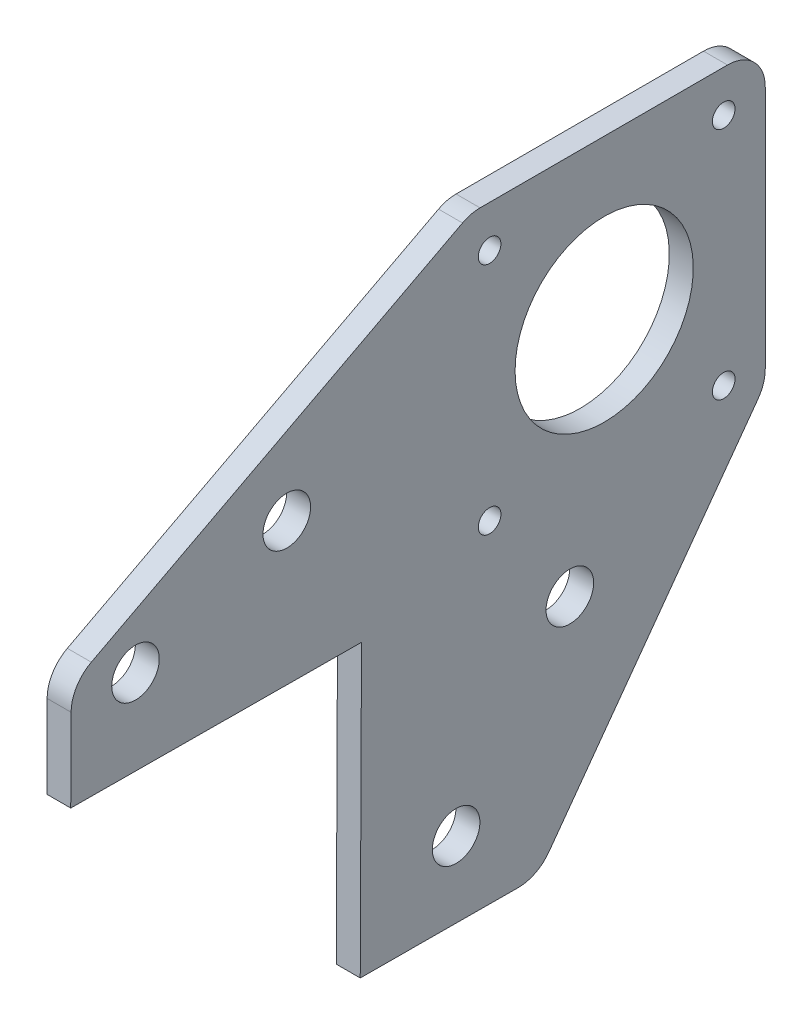
ISO-10303-21;
HEADER;
FILE_DESCRIPTION(('STEP AP214'),'2;1');
FILE_NAME('part.step','',(''),(''),'','','');
FILE_SCHEMA(('AUTOMOTIVE_DESIGN { 1 0 10303 214 1 1 1 1 }'));
ENDSEC;
DATA;
#1=APPLICATION_CONTEXT('core data for automotive mechanical design processes');
#2=APPLICATION_PROTOCOL_DEFINITION('international standard','automotive_design',2000,#1);
#3=PRODUCT_CONTEXT('',#1,'mechanical');
#4=PRODUCT('Part','Part','',(#3));
#5=PRODUCT_RELATED_PRODUCT_CATEGORY('part','',(#4));
#6=PRODUCT_DEFINITION_FORMATION('','',#4);
#7=PRODUCT_DEFINITION_CONTEXT('part definition',#1,'design');
#8=PRODUCT_DEFINITION('design','',#6,#7);
#9=PRODUCT_DEFINITION_SHAPE('','',#8);
#10=(LENGTH_UNIT() NAMED_UNIT(*) SI_UNIT(.MILLI.,.METRE.));
#11=(NAMED_UNIT(*) PLANE_ANGLE_UNIT() SI_UNIT($,.RADIAN.));
#12=(NAMED_UNIT(*) SI_UNIT($,.STERADIAN.) SOLID_ANGLE_UNIT());
#13=UNCERTAINTY_MEASURE_WITH_UNIT(LENGTH_MEASURE(1.E-05),#10,'distance_accuracy_value','');
#14=(GEOMETRIC_REPRESENTATION_CONTEXT(3) GLOBAL_UNCERTAINTY_ASSIGNED_CONTEXT((#13)) GLOBAL_UNIT_ASSIGNED_CONTEXT((#10,
#11,#12)) REPRESENTATION_CONTEXT('',''));
#15=CARTESIAN_POINT('',(0.,0.,0.));
#16=DIRECTION('',(0.,0.,1.));
#17=DIRECTION('',(1.,0.,0.));
#18=AXIS2_PLACEMENT_3D('',#15,#16,#17);
#19=CARTESIAN_POINT('',(-3.175,38.6675138744108,38.3317539258944));
#20=DIRECTION('',(0.,0.0043607119834175,0.999990492050298));
#21=DIRECTION('',(0.,-0.999990492050298,0.0043607119834175));
#22=AXIS2_PLACEMENT_3D('',#19,#20,#21);
#23=PLANE('',#22);
#24=DIRECTION('',(0.,-0.999990492050298,0.0043607119834175));
#25=VECTOR('',#24,1.);
#26=CARTESIAN_POINT('',(0.,38.6675138744108,38.3317539258944));
#27=LINE('',#26,#25);
#28=CARTESIAN_POINT('',(0.,49.6289723149698,38.2839537082349));
#29=VERTEX_POINT('',#28);
#30=CARTESIAN_POINT('',(0.,38.6675138744108,38.3317539258944));
#31=VERTEX_POINT('',#30);
#32=EDGE_CURVE('E169',#29,#31,#27,.T.);
#33=ORIENTED_EDGE('',*,*,#32,.F.);
#34=DIRECTION('',(1.,0.,0.));
#35=VECTOR('',#34,1.);
#36=CARTESIAN_POINT('',(-3.175,49.6289723149698,38.2839537082349));
#37=LINE('',#36,#35);
#38=CARTESIAN_POINT('',(-3.175,49.6289723149698,38.2839537082349));
#39=VERTEX_POINT('',#38);
#40=EDGE_CURVE('E11',#39,#29,#37,.T.);
#41=ORIENTED_EDGE('',*,*,#40,.F.);
#42=DIRECTION('',(0.,-0.999990492050298,0.0043607119834175));
#43=VECTOR('',#42,1.);
#44=CARTESIAN_POINT('',(-3.175,38.6675138744108,38.3317539258944));
#45=LINE('',#44,#43);
#46=CARTESIAN_POINT('',(-3.175,38.6675138744108,38.3317539258944));
#47=VERTEX_POINT('',#46);
#48=EDGE_CURVE('E205',#39,#47,#45,.T.);
#49=ORIENTED_EDGE('',*,*,#48,.T.);
#50=DIRECTION('',(1.,0.,0.));
#51=VECTOR('',#50,1.);
#52=CARTESIAN_POINT('',(-3.175,38.6675138744108,38.3317539258944));
#53=LINE('',#52,#51);
#54=EDGE_CURVE('E112',#47,#31,#53,.T.);
#55=ORIENTED_EDGE('',*,*,#54,.T.);
#56=EDGE_LOOP('',(#33,#41,#49,#55));
#57=FACE_BOUND('',#56,.T.);
#58=ADVANCED_FACE('F41',(#57),#23,.T.);
#59=CARTESIAN_POINT('',(-3.175,49.6071687550527,33.2840012479834));
#60=DIRECTION('',(1.,0.,0.));
#61=DIRECTION('',(0.,0.,-1.));
#62=AXIS2_PLACEMENT_3D('',#59,#60,#61);
#63=CYLINDRICAL_SURFACE('',#62,4.99999999999999);
#64=CARTESIAN_POINT('',(0.,49.6071687550527,33.2840012479834));
#65=DIRECTION('',(1.,0.,0.));
#66=DIRECTION('',(0.,0.,1.));
#67=AXIS2_PLACEMENT_3D('',#64,#65,#66);
#68=CIRCLE('',#67,4.99999999999999);
#69=CARTESIAN_POINT('',(0.,54.0347335868458,35.607074570173));
#70=VERTEX_POINT('',#69);
#71=EDGE_CURVE('E203',#70,#29,#68,.T.);
#72=ORIENTED_EDGE('',*,*,#71,.F.);
#73=DIRECTION('',(1.,0.,0.));
#74=VECTOR('',#73,1.);
#75=CARTESIAN_POINT('',(-3.175,54.0347335868458,35.607074570173));
#76=LINE('',#75,#74);
#77=CARTESIAN_POINT('',(-3.175,54.0347335868458,35.607074570173));
#78=VERTEX_POINT('',#77);
#79=EDGE_CURVE('E50',#78,#70,#76,.T.);
#80=ORIENTED_EDGE('',*,*,#79,.F.);
#81=CARTESIAN_POINT('',(-3.175,49.6071687550527,33.2840012479834));
#82=DIRECTION('',(1.,0.,0.));
#83=DIRECTION('',(0.,0.,1.));
#84=AXIS2_PLACEMENT_3D('',#81,#82,#83);
#85=CIRCLE('',#84,4.99999999999999);
#86=EDGE_CURVE('E159',#78,#39,#85,.T.);
#87=ORIENTED_EDGE('',*,*,#86,.T.);
#88=ORIENTED_EDGE('',*,*,#40,.T.);
#89=EDGE_LOOP('',(#72,#80,#87,#88));
#90=FACE_BOUND('',#89,.T.);
#91=ADVANCED_FACE('F306',(#90),#63,.T.);
#92=CARTESIAN_POINT('',(-3.175,54.0347335868458,35.607074570173));
#93=DIRECTION('',(0.,0.885512966358617,0.464614664437921));
#94=DIRECTION('',(0.,-0.464614664437921,0.885512966358618));
#95=AXIS2_PLACEMENT_3D('',#92,#93,#94);
#96=PLANE('',#95);
#97=DIRECTION('',(0.,-0.464614664437921,0.885512966358617));
#98=VECTOR('',#97,1.);
#99=CARTESIAN_POINT('',(0.,54.0347335868458,35.607074570173));
#100=LINE('',#99,#98);
#101=CARTESIAN_POINT('',(0.,79.8225437079069,-13.5421279497674));
#102=VERTEX_POINT('',#101);
#103=EDGE_CURVE('E146',#102,#70,#100,.T.);
#104=ORIENTED_EDGE('',*,*,#103,.F.);
#105=DIRECTION('',(1.,0.,0.));
#106=VECTOR('',#105,1.);
#107=CARTESIAN_POINT('',(-3.175,79.8225437079069,-13.5421279497674));
#108=LINE('',#107,#106);
#109=CARTESIAN_POINT('',(-3.175,79.8225437079069,-13.5421279497674));
#110=VERTEX_POINT('',#109);
#111=EDGE_CURVE('E141',#110,#102,#108,.T.);
#112=ORIENTED_EDGE('',*,*,#111,.F.);
#113=DIRECTION('',(0.,-0.464614664437921,0.885512966358617));
#114=VECTOR('',#113,1.);
#115=CARTESIAN_POINT('',(-3.175,54.0347335868458,35.607074570173));
#116=LINE('',#115,#114);
#117=EDGE_CURVE('E144',#110,#78,#116,.T.);
#118=ORIENTED_EDGE('',*,*,#117,.T.);
#119=ORIENTED_EDGE('',*,*,#79,.T.);
#120=EDGE_LOOP('',(#104,#112,#118,#119));
#121=FACE_BOUND('',#120,.T.);
#122=ADVANCED_FACE('F143',(#121),#96,.T.);
#123=CARTESIAN_POINT('',(-3.175,75.3949788761138,-15.8652012719571));
#124=DIRECTION('',(1.,0.,0.));
#125=DIRECTION('',(0.,0.,-1.));
#126=AXIS2_PLACEMENT_3D('',#123,#124,#125);
#127=CYLINDRICAL_SURFACE('',#126,5.);
#128=CARTESIAN_POINT('',(0.,75.3949788761138,-15.8652012719571));
#129=DIRECTION('',(1.,0.,0.));
#130=DIRECTION('',(0.,0.,-1.));
#131=AXIS2_PLACEMENT_3D('',#128,#129,#130);
#132=CIRCLE('',#131,5.);
#133=CARTESIAN_POINT('',(0.,80.3949788761138,-15.8652012719571));
#134=VERTEX_POINT('',#133);
#135=EDGE_CURVE('E200',#134,#102,#132,.T.);
#136=ORIENTED_EDGE('',*,*,#135,.F.);
#137=DIRECTION('',(1.,0.,0.));
#138=VECTOR('',#137,1.);
#139=CARTESIAN_POINT('',(-3.175,80.3949788761138,-15.8652012719571));
#140=LINE('',#139,#138);
#141=CARTESIAN_POINT('',(-3.175,80.3949788761138,-15.8652012719571));
#142=VERTEX_POINT('',#141);
#143=EDGE_CURVE('E151',#142,#134,#140,.T.);
#144=ORIENTED_EDGE('',*,*,#143,.F.);
#145=CARTESIAN_POINT('',(-3.175,75.3949788761138,-15.8652012719571));
#146=DIRECTION('',(1.,0.,0.));
#147=DIRECTION('',(0.,0.,-1.));
#148=AXIS2_PLACEMENT_3D('',#145,#146,#147);
#149=CIRCLE('',#148,5.);
#150=EDGE_CURVE('E157',#142,#110,#149,.T.);
#151=ORIENTED_EDGE('',*,*,#150,.T.);
#152=ORIENTED_EDGE('',*,*,#111,.T.);
#153=EDGE_LOOP('',(#136,#144,#151,#152));
#154=FACE_BOUND('',#153,.T.);
#155=ADVANCED_FACE('F161',(#154),#127,.T.);
#156=CARTESIAN_POINT('',(-3.175,80.3949788761138,-15.8652012719571));
#157=DIRECTION('',(0.,1.,0.));
#158=DIRECTION('',(0.,0.,1.));
#159=AXIS2_PLACEMENT_3D('',#156,#157,#158);
#160=PLANE('',#159);
#161=DIRECTION('',(0.,0.,1.));
#162=VECTOR('',#161,1.);
#163=CARTESIAN_POINT('',(0.,80.3949788761138,-15.8652012719571));
#164=LINE('',#163,#162);
#165=CARTESIAN_POINT('',(0.,80.3949788761138,-48.6265425711082));
#166=VERTEX_POINT('',#165);
#167=EDGE_CURVE('E197',#166,#134,#164,.T.);
#168=ORIENTED_EDGE('',*,*,#167,.F.);
#169=DIRECTION('',(1.,0.,0.));
#170=VECTOR('',#169,1.);
#171=CARTESIAN_POINT('',(-3.175,80.3949788761138,-48.6265425711082));
#172=LINE('',#171,#170);
#173=CARTESIAN_POINT('',(-3.175,80.3949788761138,-48.6265425711082));
#174=VERTEX_POINT('',#173);
#175=EDGE_CURVE('E209',#174,#166,#172,.T.);
#176=ORIENTED_EDGE('',*,*,#175,.F.);
#177=DIRECTION('',(0.,0.,1.));
#178=VECTOR('',#177,1.);
#179=CARTESIAN_POINT('',(-3.175,80.3949788761138,-15.8652012719571));
#180=LINE('',#179,#178);
#181=EDGE_CURVE('E162',#174,#142,#180,.T.);
#182=ORIENTED_EDGE('',*,*,#181,.T.);
#183=ORIENTED_EDGE('',*,*,#143,.T.);
#184=EDGE_LOOP('',(#168,#176,#182,#183));
#185=FACE_BOUND('',#184,.T.);
#186=ADVANCED_FACE('F313',(#185),#160,.T.);
#187=CARTESIAN_POINT('',(-3.175,75.3949788761138,-48.6265425711083));
#188=DIRECTION('',(1.,0.,0.));
#189=DIRECTION('',(0.,0.,-1.));
#190=AXIS2_PLACEMENT_3D('',#187,#188,#189);
#191=CYLINDRICAL_SURFACE('',#190,5.);
#192=CARTESIAN_POINT('',(0.,75.3949788761138,-48.6265425711083));
#193=DIRECTION('',(1.,0.,0.));
#194=DIRECTION('',(0.,0.,-1.));
#195=AXIS2_PLACEMENT_3D('',#192,#193,#194);
#196=CIRCLE('',#195,5.);
#197=CARTESIAN_POINT('',(0.,75.3949788761138,-53.6265425711083));
#198=VERTEX_POINT('',#197);
#199=EDGE_CURVE('E194',#198,#166,#196,.T.);
#200=ORIENTED_EDGE('',*,*,#199,.F.);
#201=DIRECTION('',(1.,0.,0.));
#202=VECTOR('',#201,1.);
#203=CARTESIAN_POINT('',(-3.175,75.3949788761138,-53.6265425711083));
#204=LINE('',#203,#202);
#205=CARTESIAN_POINT('',(-3.175,75.3949788761138,-53.6265425711083));
#206=VERTEX_POINT('',#205);
#207=EDGE_CURVE('E211',#206,#198,#204,.T.);
#208=ORIENTED_EDGE('',*,*,#207,.F.);
#209=CARTESIAN_POINT('',(-3.175,75.3949788761138,-48.6265425711083));
#210=DIRECTION('',(1.,0.,0.));
#211=DIRECTION('',(0.,0.,-1.));
#212=AXIS2_PLACEMENT_3D('',#209,#210,#211);
#213=CIRCLE('',#212,5.);
#214=EDGE_CURVE('E164',#206,#174,#213,.T.);
#215=ORIENTED_EDGE('',*,*,#214,.T.);
#216=ORIENTED_EDGE('',*,*,#175,.T.);
#217=EDGE_LOOP('',(#200,#208,#215,#216));
#218=FACE_BOUND('',#217,.T.);
#219=ADVANCED_FACE('F316',(#218),#191,.T.);
#220=CARTESIAN_POINT('',(-3.175,75.3949788761138,-53.6265425711083));
#221=DIRECTION('',(0.,0.,-1.));
#222=DIRECTION('',(0.,1.,0.));
#223=AXIS2_PLACEMENT_3D('',#220,#221,#222);
#224=PLANE('',#223);
#225=DIRECTION('',(0.,1.,0.));
#226=VECTOR('',#225,1.);
#227=CARTESIAN_POINT('',(0.,75.3949788761138,-53.6265425711083));
#228=LINE('',#227,#226);
#229=CARTESIAN_POINT('',(0.,43.0231234525696,-53.6265425711083));
#230=VERTEX_POINT('',#229);
#231=EDGE_CURVE('E191',#230,#198,#228,.T.);
#232=ORIENTED_EDGE('',*,*,#231,.F.);
#233=DIRECTION('',(1.,0.,0.));
#234=VECTOR('',#233,1.);
#235=CARTESIAN_POINT('',(-3.175,43.0231234525696,-53.6265425711083));
#236=LINE('',#235,#234);
#237=CARTESIAN_POINT('',(-3.175,43.0231234525696,-53.6265425711083));
#238=VERTEX_POINT('',#237);
#239=EDGE_CURVE('E213',#238,#230,#236,.T.);
#240=ORIENTED_EDGE('',*,*,#239,.F.);
#241=DIRECTION('',(0.,1.,0.));
#242=VECTOR('',#241,1.);
#243=CARTESIAN_POINT('',(-3.175,75.3949788761138,-53.6265425711083));
#244=LINE('',#243,#242);
#245=EDGE_CURVE('E357',#238,#206,#244,.T.);
#246=ORIENTED_EDGE('',*,*,#245,.T.);
#247=ORIENTED_EDGE('',*,*,#207,.T.);
#248=EDGE_LOOP('',(#232,#240,#246,#247));
#249=FACE_BOUND('',#248,.T.);
#250=ADVANCED_FACE('F320',(#249),#224,.T.);
#251=CARTESIAN_POINT('',(-3.175,43.0231234525696,-48.6265425711083));
#252=DIRECTION('',(1.,0.,0.));
#253=DIRECTION('',(0.,0.,-1.));
#254=AXIS2_PLACEMENT_3D('',#251,#252,#253);
#255=CYLINDRICAL_SURFACE('',#254,5.);
#256=CARTESIAN_POINT('',(0.,43.0231234525696,-48.6265425711083));
#257=DIRECTION('',(1.,0.,0.));
#258=DIRECTION('',(0.,0.,1.));
#259=AXIS2_PLACEMENT_3D('',#256,#257,#258);
#260=CIRCLE('',#259,5.);
#261=CARTESIAN_POINT('',(0.,40.0833630091223,-52.671021342859));
#262=VERTEX_POINT('',#261);
#263=EDGE_CURVE('E188',#262,#230,#260,.T.);
#264=ORIENTED_EDGE('',*,*,#263,.F.);
#265=DIRECTION('',(1.,0.,0.));
#266=VECTOR('',#265,1.);
#267=CARTESIAN_POINT('',(-3.175,40.0833630091223,-52.671021342859));
#268=LINE('',#267,#266);
#269=CARTESIAN_POINT('',(-3.175,40.0833630091223,-52.671021342859));
#270=VERTEX_POINT('',#269);
#271=EDGE_CURVE('E215',#270,#262,#268,.T.);
#272=ORIENTED_EDGE('',*,*,#271,.F.);
#273=CARTESIAN_POINT('',(-3.175,43.0231234525696,-48.6265425711083));
#274=DIRECTION('',(1.,0.,0.));
#275=DIRECTION('',(0.,0.,1.));
#276=AXIS2_PLACEMENT_3D('',#273,#274,#275);
#277=CIRCLE('',#276,5.);
#278=EDGE_CURVE('E358',#270,#238,#277,.T.);
#279=ORIENTED_EDGE('',*,*,#278,.T.);
#280=ORIENTED_EDGE('',*,*,#239,.T.);
#281=EDGE_LOOP('',(#264,#272,#279,#280));
#282=FACE_BOUND('',#281,.T.);
#283=ADVANCED_FACE('F324',(#282),#255,.T.);
#284=CARTESIAN_POINT('',(-3.175,1.97805653507974,-24.9738868096651));
#285=DIRECTION('',(0.,-0.587952088689463,-0.80889575435015));
#286=DIRECTION('',(0.,0.80889575435015,-0.587952088689463));
#287=AXIS2_PLACEMENT_3D('',#284,#285,#286);
#288=PLANE('',#287);
#289=DIRECTION('',(0.,0.80889575435015,-0.587952088689463));
#290=VECTOR('',#289,1.);
#291=CARTESIAN_POINT('',(0.,1.97805653507974,-24.9738868096651));
#292=LINE('',#291,#290);
#293=CARTESIAN_POINT('',(0.,1.97805653507974,-24.9738868096651));
#294=VERTEX_POINT('',#293);
#295=EDGE_CURVE('E185',#294,#262,#292,.T.);
#296=ORIENTED_EDGE('',*,*,#295,.F.);
#297=DIRECTION('',(1.,0.,0.));
#298=VECTOR('',#297,1.);
#299=CARTESIAN_POINT('',(-3.175,1.97805653507974,-24.9738868096651));
#300=LINE('',#299,#298);
#301=CARTESIAN_POINT('',(-3.175,1.97805653507974,-24.9738868096651));
#302=VERTEX_POINT('',#301);
#303=EDGE_CURVE('E217',#302,#294,#300,.T.);
#304=ORIENTED_EDGE('',*,*,#303,.F.);
#305=DIRECTION('',(0.,0.80889575435015,-0.587952088689463));
#306=VECTOR('',#305,1.);
#307=CARTESIAN_POINT('',(-3.175,1.97805653507974,-24.9738868096651));
#308=LINE('',#307,#306);
#309=EDGE_CURVE('E363',#302,#270,#308,.T.);
#310=ORIENTED_EDGE('',*,*,#309,.T.);
#311=ORIENTED_EDGE('',*,*,#271,.T.);
#312=EDGE_LOOP('',(#296,#304,#310,#311));
#313=FACE_BOUND('',#312,.T.);
#314=ADVANCED_FACE('F328',(#313),#288,.T.);
#315=CARTESIAN_POINT('',(-3.175,4.91781697852705,-20.9294080379144));
#316=DIRECTION('',(1.,0.,0.));
#317=DIRECTION('',(0.,0.,-1.));
#318=AXIS2_PLACEMENT_3D('',#315,#316,#317);
#319=CYLINDRICAL_SURFACE('',#318,5.);
#320=CARTESIAN_POINT('',(0.,4.91781697852705,-20.9294080379144));
#321=DIRECTION('',(1.,0.,0.));
#322=DIRECTION('',(0.,0.,-1.));
#323=AXIS2_PLACEMENT_3D('',#320,#321,#322);
#324=CIRCLE('',#323,5.);
#325=CARTESIAN_POINT('',(0.,-0.0821280120429056,-20.9059540132195));
#326=VERTEX_POINT('',#325);
#327=EDGE_CURVE('E182',#326,#294,#324,.T.);
#328=ORIENTED_EDGE('',*,*,#327,.F.);
#329=DIRECTION('',(1.,0.,0.));
#330=VECTOR('',#329,1.);
#331=CARTESIAN_POINT('',(-3.175,-0.0821280120429056,-20.9059540132195));
#332=LINE('',#331,#330);
#333=CARTESIAN_POINT('',(-3.175,-0.0821280120429056,-20.9059540132195));
#334=VERTEX_POINT('',#333);
#335=EDGE_CURVE('E219',#334,#326,#332,.T.);
#336=ORIENTED_EDGE('',*,*,#335,.F.);
#337=CARTESIAN_POINT('',(-3.175,4.91781697852705,-20.9294080379144));
#338=DIRECTION('',(1.,0.,0.));
#339=DIRECTION('',(0.,0.,-1.));
#340=AXIS2_PLACEMENT_3D('',#337,#338,#339);
#341=CIRCLE('',#340,5.);
#342=EDGE_CURVE('E366',#334,#302,#341,.T.);
#343=ORIENTED_EDGE('',*,*,#342,.T.);
#344=ORIENTED_EDGE('',*,*,#303,.T.);
#345=EDGE_LOOP('',(#328,#336,#343,#344));
#346=FACE_BOUND('',#345,.T.);
#347=ADVANCED_FACE('F332',(#346),#319,.T.);
#348=CARTESIAN_POINT('',(-3.175,0.0159384931837013,-6.95038390645343E-05));
#349=DIRECTION('',(0.,-0.999988998113992,0.00469080493896794));
#350=DIRECTION('',(0.,-0.00469080493896794,-0.999988998113992));
#351=AXIS2_PLACEMENT_3D('',#348,#349,#350);
#352=PLANE('',#351);
#353=DIRECTION('',(0.,-0.00469080493896794,-0.999988998113992));
#354=VECTOR('',#353,1.);
#355=CARTESIAN_POINT('',(0.,0.0159384931837013,-6.95038390645343E-05));
#356=LINE('',#355,#354);
#357=CARTESIAN_POINT('',(0.,0.0159384931837013,-6.95038390645343E-05));
#358=VERTEX_POINT('',#357);
#359=EDGE_CURVE('E179',#358,#326,#356,.T.);
#360=ORIENTED_EDGE('',*,*,#359,.F.);
#361=DIRECTION('',(1.,0.,0.));
#362=VECTOR('',#361,1.);
#363=CARTESIAN_POINT('',(-3.175,0.0159384931837013,-6.95038390645343E-05));
#364=LINE('',#363,#362);
#365=CARTESIAN_POINT('',(-3.175,0.0159384931837013,-6.95038390645343E-05));
#366=VERTEX_POINT('',#365);
#367=EDGE_CURVE('E221',#366,#358,#364,.T.);
#368=ORIENTED_EDGE('',*,*,#367,.F.);
#369=DIRECTION('',(0.,-0.00469080493896794,-0.999988998113992));
#370=VECTOR('',#369,1.);
#371=CARTESIAN_POINT('',(-3.175,0.0159384931837013,-6.95038390645343E-05));
#372=LINE('',#371,#370);
#373=EDGE_CURVE('E369',#366,#334,#372,.T.);
#374=ORIENTED_EDGE('',*,*,#373,.T.);
#375=ORIENTED_EDGE('',*,*,#335,.T.);
#376=EDGE_LOOP('',(#360,#368,#374,#375));
#377=FACE_BOUND('',#376,.T.);
#378=ADVANCED_FACE('F336',(#377),#352,.T.);
#379=CARTESIAN_POINT('',(-3.175,0.0159384931837013,-6.95038390645343E-05));
#380=DIRECTION('',(0.,0.00436071198341801,0.999990492050298));
#381=DIRECTION('',(0.,-0.999990492050298,0.00436071198341801));
#382=AXIS2_PLACEMENT_3D('',#379,#380,#381);
#383=PLANE('',#382);
#384=DIRECTION('',(0.,-0.999990492050298,0.00436071198341801));
#385=VECTOR('',#384,1.);
#386=CARTESIAN_POINT('',(0.,0.0159384931837013,-6.95038390645343E-05));
#387=LINE('',#386,#385);
#388=CARTESIAN_POINT('',(0.,38.4278979733548,-0.167574588480734));
#389=VERTEX_POINT('',#388);
#390=EDGE_CURVE('E176',#389,#358,#387,.T.);
#391=ORIENTED_EDGE('',*,*,#390,.F.);
#392=DIRECTION('',(1.,0.,0.));
#393=VECTOR('',#392,1.);
#394=CARTESIAN_POINT('',(-3.175,38.4278979733548,-0.167574588480734));
#395=LINE('',#394,#393);
#396=CARTESIAN_POINT('',(-3.175,38.4278979733548,-0.167574588480734));
#397=VERTEX_POINT('',#396);
#398=EDGE_CURVE('E223',#397,#389,#395,.T.);
#399=ORIENTED_EDGE('',*,*,#398,.F.);
#400=DIRECTION('',(0.,-0.999990492050298,0.00436071198341801));
#401=VECTOR('',#400,1.);
#402=CARTESIAN_POINT('',(-3.175,0.0159384931837013,-6.95038390645343E-05));
#403=LINE('',#402,#401);
#404=EDGE_CURVE('E372',#397,#366,#403,.T.);
#405=ORIENTED_EDGE('',*,*,#404,.T.);
#406=ORIENTED_EDGE('',*,*,#367,.T.);
#407=EDGE_LOOP('',(#391,#399,#405,#406));
#408=FACE_BOUND('',#407,.T.);
#409=ADVANCED_FACE('F340',(#408),#383,.T.);
#410=CARTESIAN_POINT('',(-3.175,38.4278979733548,-0.167574588480734));
#411=DIRECTION('',(0.,-0.999980632108348,0.00622377764619177));
#412=DIRECTION('',(0.,-0.00622377764619177,-0.999980632108348));
#413=AXIS2_PLACEMENT_3D('',#410,#411,#412);
#414=PLANE('',#413);
#415=DIRECTION('',(0.,-0.00622377764619178,-0.999980632108348));
#416=VECTOR('',#415,1.);
#417=CARTESIAN_POINT('',(0.,38.4278979733548,-0.167574588480734));
#418=LINE('',#417,#416);
#419=EDGE_CURVE('E172',#31,#389,#418,.T.);
#420=ORIENTED_EDGE('',*,*,#419,.F.);
#421=ORIENTED_EDGE('',*,*,#54,.F.);
#422=DIRECTION('',(0.,-0.00622377764619178,-0.999980632108348));
#423=VECTOR('',#422,1.);
#424=CARTESIAN_POINT('',(-3.175,38.4278979733548,-0.167574588480734));
#425=LINE('',#424,#423);
#426=EDGE_CURVE('E375',#47,#397,#425,.T.);
#427=ORIENTED_EDGE('',*,*,#426,.T.);
#428=ORIENTED_EDGE('',*,*,#398,.T.);
#429=EDGE_LOOP('',(#420,#421,#427,#428));
#430=FACE_BOUND('',#429,.T.);
#431=ADVANCED_FACE('F302',(#430),#414,.T.);
#432=CARTESIAN_POINT('',(-3.175,49.6071687550527,33.2840012479834));
#433=DIRECTION('',(-1.,0.,0.));
#434=DIRECTION('',(0.,0.,1.));
#435=AXIS2_PLACEMENT_3D('',#432,#433,#434);
#436=PLANE('',#435);
#437=CARTESIAN_POINT('',(-3.17500000000004,29.8860773312936,-27.7543230800745));
#438=DIRECTION('',(-1.,0.,0.));
#439=DIRECTION('',(0.,0.,1.));
#440=AXIS2_PLACEMENT_3D('',#437,#438,#439);
#441=CIRCLE('',#440,3.14999999999991);
#442=CARTESIAN_POINT('',(-3.17500000000004,29.8860773312936,-24.6043230800746));
#443=VERTEX_POINT('',#442);
#444=EDGE_CURVE('E230',#443,#443,#441,.T.);
#445=ORIENTED_EDGE('',*,*,#444,.F.);
#446=EDGE_LOOP('',(#445));
#447=FACE_BOUND('',#446,.T.);
#448=CARTESIAN_POINT('',(-3.17500000000004,9.95650102206902,-12.6944443127175));
#449=DIRECTION('',(-1.,0.,0.));
#450=DIRECTION('',(0.,0.,1.));
#451=AXIS2_PLACEMENT_3D('',#448,#449,#450);
#452=CIRCLE('',#451,3.14999999999991);
#453=CARTESIAN_POINT('',(-3.17500000000004,9.95650102206902,-9.54444431271758));
#454=VERTEX_POINT('',#453);
#455=EDGE_CURVE('E547',#454,#454,#452,.T.);
#456=ORIENTED_EDGE('',*,*,#455,.F.);
#457=EDGE_LOOP('',(#456));
#458=FACE_BOUND('',#457,.T.);
#459=CARTESIAN_POINT('',(-3.17500000000004,49.9132660294018,29.7564021962411));
#460=DIRECTION('',(-1.,0.,0.));
#461=DIRECTION('',(0.,0.,1.));
#462=AXIS2_PLACEMENT_3D('',#459,#460,#461);
#463=CIRCLE('',#462,3.14999999999991);
#464=CARTESIAN_POINT('',(-3.17500000000004,49.9132660294018,32.906402196241));
#465=VERTEX_POINT('',#464);
#466=EDGE_CURVE('E550',#465,#465,#463,.T.);
#467=ORIENTED_EDGE('',*,*,#466,.F.);
#468=EDGE_LOOP('',(#467));
#469=FACE_BOUND('',#468,.T.);
#470=CARTESIAN_POINT('',(-3.17500000000004,57.3259806333188,9.72392214876416));
#471=DIRECTION('',(-1.,0.,0.));
#472=DIRECTION('',(0.,0.,1.));
#473=AXIS2_PLACEMENT_3D('',#470,#471,#472);
#474=CIRCLE('',#473,3.14999999999991);
#475=CARTESIAN_POINT('',(-3.17500000000004,57.3259806333188,12.8739221487641));
#476=VERTEX_POINT('',#475);
#477=EDGE_CURVE('E554',#476,#476,#474,.T.);
#478=ORIENTED_EDGE('',*,*,#477,.F.);
#479=EDGE_LOOP('',(#478));
#480=FACE_BOUND('',#479,.T.);
#481=CARTESIAN_POINT('',(-3.175,74.8949047873744,-48.1265757252046));
#482=DIRECTION('',(1.,0.,0.));
#483=DIRECTION('',(0.,0.871986082034546,0.489530665779012));
#484=AXIS2_PLACEMENT_3D('',#481,#482,#483);
#485=ELLIPSE('',#484,1.50000000000002,1.49999995810713);
#486=CARTESIAN_POINT('',(-3.175,76.2028839104263,-47.3922797265361));
#487=VERTEX_POINT('',#486);
#488=EDGE_CURVE('E241',#487,#487,#485,.T.);
#489=ORIENTED_EDGE('',*,*,#488,.T.);
#490=EDGE_LOOP('',(#489));
#491=FACE_BOUND('',#490,.T.);
#492=CARTESIAN_POINT('',(-3.175,74.8912262394763,-17.1265766018546));
#493=DIRECTION('',(1.,0.,0.));
#494=DIRECTION('',(0.,0.871986082034549,0.489530665779007));
#495=AXIS2_PLACEMENT_3D('',#492,#493,#494);
#496=ELLIPSE('',#495,1.5,1.49999995810712);
#497=CARTESIAN_POINT('',(-3.175,76.1992053625281,-16.3922806031861));
#498=VERTEX_POINT('',#497);
#499=EDGE_CURVE('E251',#498,#498,#496,.T.);
#500=ORIENTED_EDGE('',*,*,#499,.T.);
#501=EDGE_LOOP('',(#500));
#502=FACE_BOUND('',#501,.T.);
#503=CARTESIAN_POINT('',(-3.175,43.8943267317824,-48.1292245810179));
#504=DIRECTION('',(1.,0.,0.));
#505=DIRECTION('',(0.,0.871986082034548,0.489530665779009));
#506=AXIS2_PLACEMENT_3D('',#503,#504,#505);
#507=ELLIPSE('',#506,1.5,1.49999995810713);
#508=CARTESIAN_POINT('',(-3.175,45.2023058548342,-47.3949285823494));
#509=VERTEX_POINT('',#508);
#510=EDGE_CURVE('E271',#509,#509,#507,.T.);
#511=ORIENTED_EDGE('',*,*,#510,.T.);
#512=EDGE_LOOP('',(#511));
#513=FACE_BOUND('',#512,.T.);
#514=CARTESIAN_POINT('',(-3.175,43.891226665207,-17.1302558888449));
#515=DIRECTION('',(1.,0.,0.));
#516=DIRECTION('',(0.,0.,-1.));
#517=AXIS2_PLACEMENT_3D('',#514,#515,#516);
#518=CIRCLE('',#517,1.5);
#519=CARTESIAN_POINT('',(-3.175,43.891226665207,-18.6302558888449));
#520=VERTEX_POINT('',#519);
#521=EDGE_CURVE('E278',#520,#520,#518,.T.);
#522=ORIENTED_EDGE('',*,*,#521,.T.);
#523=EDGE_LOOP('',(#522));
#524=FACE_BOUND('',#523,.T.);
#525=CARTESIAN_POINT('',(-3.175,47.5920775652809,-32.3026165784225));
#526=CARTESIAN_POINT('',(-3.175,47.5922611570808,-33.8470250103678));
#527=CARTESIAN_POINT('',(-3.175,48.2070322489464,-36.935768822248));
#528=CARTESIAN_POINT('',(-3.175,50.8320106203035,-40.8633155115509));
#529=CARTESIAN_POINT('',(-3.175,54.7601815592492,-43.4873597930692));
#530=CARTESIAN_POINT('',(-3.175,59.3935166484087,-44.4084147163819));
#531=CARTESIAN_POINT('',(-3.175,64.0266326254915,-43.4862580213012));
#532=CARTESIAN_POINT('',(-3.175,67.9541795860339,-40.861279702778));
#533=CARTESIAN_POINT('',(-3.175,70.5782241077157,-36.9331089099005));
#534=CARTESIAN_POINT('',(-3.175,71.4992791947141,-32.2997740360489));
#535=CARTESIAN_POINT('',(-3.175,70.5771225569158,-27.6666583182287));
#536=CARTESIAN_POINT('',(-3.175,67.9521441855587,-23.7391116289257));
#537=CARTESIAN_POINT('',(-3.175,64.023973246613,-21.1150673474074));
#538=CARTESIAN_POINT('',(-3.175,59.3906381574535,-20.1940124240948));
#539=CARTESIAN_POINT('',(-3.175,54.7575221803707,-21.1161691191755));
#540=CARTESIAN_POINT('',(-3.175,50.8299752198282,-23.7411474376987));
#541=CARTESIAN_POINT('',(-3.175,48.2059306981465,-27.6693182305761));
#542=CARTESIAN_POINT('',(-3.175,47.5918939734809,-30.7582081464772));
#543=CARTESIAN_POINT('',(-3.175,47.5920775652809,-32.3026165784225));
#544=B_SPLINE_CURVE_WITH_KNOTS('',3,(#525,#526,#527,#528,#529,#530,#531,#532,#533,#534,#535,
#536,#537,#538,#539,#540,#541,#542,#543),.UNSPECIFIED.,.T.,.F.,(4,1,1,1,1,1,1,1,1,1,1,1,1,1,1,1,
4),(0.,0.392699081698725,0.785398163397448,1.17809724509617,1.5707963267949,1.96349540849362,
2.35619449019234,2.74889357189107,3.14159265358979,3.53429173528852,3.92699081698724,
4.31968989868597,4.71238898038469,5.10508806208341,5.49778714378214,5.89048622548086,
6.28318530717959),.UNSPECIFIED.);
#545=CARTESIAN_POINT('',(-3.175,47.5920775652809,-32.3026165784225));
#546=VERTEX_POINT('',#545);
#547=EDGE_CURVE('E173',#546,#546,#544,.T.);
#548=ORIENTED_EDGE('',*,*,#547,.T.);
#549=EDGE_LOOP('',(#548));
#550=FACE_BOUND('',#549,.T.);
#551=ORIENTED_EDGE('',*,*,#48,.F.);
#552=ORIENTED_EDGE('',*,*,#86,.F.);
#553=ORIENTED_EDGE('',*,*,#117,.F.);
#554=ORIENTED_EDGE('',*,*,#150,.F.);
#555=ORIENTED_EDGE('',*,*,#181,.F.);
#556=ORIENTED_EDGE('',*,*,#214,.F.);
#557=ORIENTED_EDGE('',*,*,#245,.F.);
#558=ORIENTED_EDGE('',*,*,#278,.F.);
#559=ORIENTED_EDGE('',*,*,#309,.F.);
#560=ORIENTED_EDGE('',*,*,#342,.F.);
#561=ORIENTED_EDGE('',*,*,#373,.F.);
#562=ORIENTED_EDGE('',*,*,#404,.F.);
#563=ORIENTED_EDGE('',*,*,#426,.F.);
#564=EDGE_LOOP('',(#551,#552,#553,#554,#555,#556,#557,#558,#559,#560,#561,#562,#563));
#565=FACE_BOUND('',#564,.T.);
#566=ADVANCED_FACE('F155',(#447,#458,#469,#480,#491,#502,#513,#524,#550,#565),#436,.T.);
#567=CARTESIAN_POINT('',(0.,49.6071687550527,33.2840012479834));
#568=DIRECTION('',(-1.,0.,0.));
#569=DIRECTION('',(0.,0.,1.));
#570=AXIS2_PLACEMENT_3D('',#567,#568,#569);
#571=PLANE('',#570);
#572=CARTESIAN_POINT('',(0.,29.8860773312936,-27.7543230800745));
#573=DIRECTION('',(-1.,0.,0.));
#574=DIRECTION('',(0.,0.,1.));
#575=AXIS2_PLACEMENT_3D('',#572,#573,#574);
#576=CIRCLE('',#575,3.14999999999991);
#577=CARTESIAN_POINT('',(0.,29.8860773312936,-24.6043230800746));
#578=VERTEX_POINT('',#577);
#579=EDGE_CURVE('E44',#578,#578,#576,.T.);
#580=ORIENTED_EDGE('',*,*,#579,.T.);
#581=EDGE_LOOP('',(#580));
#582=FACE_BOUND('',#581,.T.);
#583=CARTESIAN_POINT('',(0.,9.95650102206902,-12.6944443127175));
#584=DIRECTION('',(-1.,0.,0.));
#585=DIRECTION('',(0.,0.,1.));
#586=AXIS2_PLACEMENT_3D('',#583,#584,#585);
#587=CIRCLE('',#586,3.14999999999991);
#588=CARTESIAN_POINT('',(0.,9.95650102206902,-9.54444431271758));
#589=VERTEX_POINT('',#588);
#590=EDGE_CURVE('E232',#589,#589,#587,.T.);
#591=ORIENTED_EDGE('',*,*,#590,.T.);
#592=EDGE_LOOP('',(#591));
#593=FACE_BOUND('',#592,.T.);
#594=CARTESIAN_POINT('',(0.,49.9132660294018,29.7564021962411));
#595=DIRECTION('',(-1.,0.,0.));
#596=DIRECTION('',(0.,0.,1.));
#597=AXIS2_PLACEMENT_3D('',#594,#595,#596);
#598=CIRCLE('',#597,3.14999999999991);
#599=CARTESIAN_POINT('',(0.,49.9132660294018,32.906402196241));
#600=VERTEX_POINT('',#599);
#601=EDGE_CURVE('E229',#600,#600,#598,.T.);
#602=ORIENTED_EDGE('',*,*,#601,.T.);
#603=EDGE_LOOP('',(#602));
#604=FACE_BOUND('',#603,.T.);
#605=CARTESIAN_POINT('',(0.,57.3259806333188,9.72392214876416));
#606=DIRECTION('',(-1.,0.,0.));
#607=DIRECTION('',(0.,0.,1.));
#608=AXIS2_PLACEMENT_3D('',#605,#606,#607);
#609=CIRCLE('',#608,3.14999999999991);
#610=CARTESIAN_POINT('',(0.,57.3259806333188,12.8739221487641));
#611=VERTEX_POINT('',#610);
#612=EDGE_CURVE('E226',#611,#611,#609,.T.);
#613=ORIENTED_EDGE('',*,*,#612,.T.);
#614=EDGE_LOOP('',(#613));
#615=FACE_BOUND('',#614,.T.);
#616=CARTESIAN_POINT('',(0.,74.8949047873744,-48.1265757252046));
#617=DIRECTION('',(1.,0.,0.));
#618=DIRECTION('',(0.,0.871986082034546,0.489530665779012));
#619=AXIS2_PLACEMENT_3D('',#616,#617,#618);
#620=ELLIPSE('',#619,1.50000000000002,1.49999995810713);
#621=CARTESIAN_POINT('',(0.,76.2028839104263,-47.3922797265361));
#622=VERTEX_POINT('',#621);
#623=EDGE_CURVE('E237',#622,#622,#620,.T.);
#624=ORIENTED_EDGE('',*,*,#623,.F.);
#625=EDGE_LOOP('',(#624));
#626=FACE_BOUND('',#625,.T.);
#627=CARTESIAN_POINT('',(0.,74.8912262394763,-17.1265766018546));
#628=DIRECTION('',(1.,0.,0.));
#629=DIRECTION('',(0.,0.871986082034549,0.489530665779007));
#630=AXIS2_PLACEMENT_3D('',#627,#628,#629);
#631=ELLIPSE('',#630,1.5,1.49999995810712);
#632=CARTESIAN_POINT('',(0.,76.1992053625281,-16.3922806031861));
#633=VERTEX_POINT('',#632);
#634=EDGE_CURVE('E246',#633,#633,#631,.T.);
#635=ORIENTED_EDGE('',*,*,#634,.F.);
#636=EDGE_LOOP('',(#635));
#637=FACE_BOUND('',#636,.T.);
#638=CARTESIAN_POINT('',(0.,43.8943267317824,-48.1292245810179));
#639=DIRECTION('',(1.,0.,0.));
#640=DIRECTION('',(0.,0.871986082034548,0.489530665779009));
#641=AXIS2_PLACEMENT_3D('',#638,#639,#640);
#642=ELLIPSE('',#641,1.5,1.49999995810713);
#643=CARTESIAN_POINT('',(0.,45.2023058548342,-47.3949285823494));
#644=VERTEX_POINT('',#643);
#645=EDGE_CURVE('E255',#644,#644,#642,.T.);
#646=ORIENTED_EDGE('',*,*,#645,.F.);
#647=EDGE_LOOP('',(#646));
#648=FACE_BOUND('',#647,.T.);
#649=CARTESIAN_POINT('',(0.,43.891226665207,-17.1302558888449));
#650=DIRECTION('',(1.,0.,0.));
#651=DIRECTION('',(0.,0.,-1.));
#652=AXIS2_PLACEMENT_3D('',#649,#650,#651);
#653=CIRCLE('',#652,1.5);
#654=CARTESIAN_POINT('',(0.,43.891226665207,-18.6302558888449));
#655=VERTEX_POINT('',#654);
#656=EDGE_CURVE('E275',#655,#655,#653,.T.);
#657=ORIENTED_EDGE('',*,*,#656,.F.);
#658=EDGE_LOOP('',(#657));
#659=FACE_BOUND('',#658,.T.);
#660=CARTESIAN_POINT('',(0.,47.5920775652809,-32.3026165784225));
#661=CARTESIAN_POINT('',(0.,47.5922611570808,-33.8470250103678));
#662=CARTESIAN_POINT('',(0.,48.2070322489464,-36.935768822248));
#663=CARTESIAN_POINT('',(0.,50.8320106203035,-40.8633155115509));
#664=CARTESIAN_POINT('',(0.,54.7601815592492,-43.4873597930692));
#665=CARTESIAN_POINT('',(0.,59.3935166484087,-44.4084147163819));
#666=CARTESIAN_POINT('',(0.,64.0266326254915,-43.4862580213012));
#667=CARTESIAN_POINT('',(0.,67.9541795860339,-40.861279702778));
#668=CARTESIAN_POINT('',(0.,70.5782241077157,-36.9331089099005));
#669=CARTESIAN_POINT('',(0.,71.4992791947141,-32.2997740360489));
#670=CARTESIAN_POINT('',(0.,70.5771225569158,-27.6666583182287));
#671=CARTESIAN_POINT('',(0.,67.9521441855587,-23.7391116289257));
#672=CARTESIAN_POINT('',(0.,64.023973246613,-21.1150673474074));
#673=CARTESIAN_POINT('',(0.,59.3906381574535,-20.1940124240948));
#674=CARTESIAN_POINT('',(0.,54.7575221803707,-21.1161691191755));
#675=CARTESIAN_POINT('',(0.,50.8299752198282,-23.7411474376987));
#676=CARTESIAN_POINT('',(0.,48.2059306981465,-27.6693182305761));
#677=CARTESIAN_POINT('',(0.,47.5918939734809,-30.7582081464772));
#678=CARTESIAN_POINT('',(0.,47.5920775652809,-32.3026165784225));
#679=B_SPLINE_CURVE_WITH_KNOTS('',3,(#660,#661,#662,#663,#664,#665,#666,#667,#668,#669,#670,
#671,#672,#673,#674,#675,#676,#677,#678),.UNSPECIFIED.,.T.,.F.,(4,1,1,1,1,1,1,1,1,1,1,1,1,1,1,1,
4),(0.,0.392699081698725,0.785398163397448,1.17809724509617,1.5707963267949,1.96349540849362,
2.35619449019234,2.74889357189107,3.14159265358979,3.53429173528852,3.92699081698724,
4.31968989868597,4.71238898038469,5.10508806208341,5.49778714378214,5.89048622548086,
6.28318530717959),.UNSPECIFIED.);
#680=CARTESIAN_POINT('',(0.,47.5920775652809,-32.3026165784225));
#681=VERTEX_POINT('',#680);
#682=EDGE_CURVE('E281',#681,#681,#679,.T.);
#683=ORIENTED_EDGE('',*,*,#682,.F.);
#684=EDGE_LOOP('',(#683));
#685=FACE_BOUND('',#684,.T.);
#686=ORIENTED_EDGE('',*,*,#32,.T.);
#687=ORIENTED_EDGE('',*,*,#419,.T.);
#688=ORIENTED_EDGE('',*,*,#390,.T.);
#689=ORIENTED_EDGE('',*,*,#359,.T.);
#690=ORIENTED_EDGE('',*,*,#327,.T.);
#691=ORIENTED_EDGE('',*,*,#295,.T.);
#692=ORIENTED_EDGE('',*,*,#263,.T.);
#693=ORIENTED_EDGE('',*,*,#231,.T.);
#694=ORIENTED_EDGE('',*,*,#199,.T.);
#695=ORIENTED_EDGE('',*,*,#167,.T.);
#696=ORIENTED_EDGE('',*,*,#135,.T.);
#697=ORIENTED_EDGE('',*,*,#103,.T.);
#698=ORIENTED_EDGE('',*,*,#71,.T.);
#699=EDGE_LOOP('',(#686,#687,#688,#689,#690,#691,#692,#693,#694,#695,#696,#697,#698));
#700=FACE_BOUND('',#699,.T.);
#701=ADVANCED_FACE('F298',(#582,#593,#604,#615,#626,#637,#648,#659,#685,#700),#571,.F.);
#702=DIRECTION('',(1.,0.,0.));
#703=VECTOR('',#702,1.);
#704=SURFACE_OF_LINEAR_EXTRUSION('',#544,#703);
#705=ORIENTED_EDGE('',*,*,#547,.F.);
#706=EDGE_LOOP('',(#705));
#707=FACE_BOUND('',#706,.T.);
#708=ORIENTED_EDGE('',*,*,#682,.T.);
#709=EDGE_LOOP('',(#708));
#710=FACE_BOUND('',#709,.T.);
#711=ADVANCED_FACE('F295',(#707,#710),#704,.F.);
#712=CARTESIAN_POINT('',(-3.175,43.891226665207,-17.1302558888449));
#713=DIRECTION('',(1.,0.,0.));
#714=DIRECTION('',(0.,0.,-1.));
#715=AXIS2_PLACEMENT_3D('',#712,#713,#714);
#716=CYLINDRICAL_SURFACE('',#715,1.5);
#717=ORIENTED_EDGE('',*,*,#521,.F.);
#718=EDGE_LOOP('',(#717));
#719=FACE_BOUND('',#718,.T.);
#720=ORIENTED_EDGE('',*,*,#656,.T.);
#721=EDGE_LOOP('',(#720));
#722=FACE_BOUND('',#721,.T.);
#723=ADVANCED_FACE('F268',(#719,#722),#716,.F.);
#724=DIRECTION('',(1.,0.,0.));
#725=VECTOR('',#724,1.);
#726=SURFACE_OF_LINEAR_EXTRUSION('',#507,#725);
#727=ORIENTED_EDGE('',*,*,#510,.F.);
#728=EDGE_LOOP('',(#727));
#729=FACE_BOUND('',#728,.T.);
#730=ORIENTED_EDGE('',*,*,#645,.T.);
#731=EDGE_LOOP('',(#730));
#732=FACE_BOUND('',#731,.T.);
#733=ADVANCED_FACE('F263',(#729,#732),#726,.F.);
#734=DIRECTION('',(1.,0.,0.));
#735=VECTOR('',#734,1.);
#736=SURFACE_OF_LINEAR_EXTRUSION('',#496,#735);
#737=ORIENTED_EDGE('',*,*,#499,.F.);
#738=EDGE_LOOP('',(#737));
#739=FACE_BOUND('',#738,.T.);
#740=ORIENTED_EDGE('',*,*,#634,.T.);
#741=EDGE_LOOP('',(#740));
#742=FACE_BOUND('',#741,.T.);
#743=ADVANCED_FACE('F258',(#739,#742),#736,.F.);
#744=DIRECTION('',(1.,0.,0.));
#745=VECTOR('',#744,1.);
#746=SURFACE_OF_LINEAR_EXTRUSION('',#485,#745);
#747=ORIENTED_EDGE('',*,*,#488,.F.);
#748=EDGE_LOOP('',(#747));
#749=FACE_BOUND('',#748,.T.);
#750=ORIENTED_EDGE('',*,*,#623,.T.);
#751=EDGE_LOOP('',(#750));
#752=FACE_BOUND('',#751,.T.);
#753=ADVANCED_FACE('F262',(#749,#752),#746,.F.);
#754=CARTESIAN_POINT('',(6.82499999999996,57.3259806333188,9.72392214876416));
#755=DIRECTION('',(-1.,0.,0.));
#756=DIRECTION('',(0.,0.,1.));
#757=AXIS2_PLACEMENT_3D('',#754,#755,#756);
#758=CYLINDRICAL_SURFACE('',#757,3.14999999999991);
#759=ORIENTED_EDGE('',*,*,#477,.T.);
#760=EDGE_LOOP('',(#759));
#761=FACE_BOUND('',#760,.T.);
#762=ORIENTED_EDGE('',*,*,#612,.F.);
#763=EDGE_LOOP('',(#762));
#764=FACE_BOUND('',#763,.T.);
#765=ADVANCED_FACE('F503',(#761,#764),#758,.F.);
#766=CARTESIAN_POINT('',(6.82499999999996,49.9132660294018,29.7564021962411));
#767=DIRECTION('',(-1.,0.,0.));
#768=DIRECTION('',(0.,0.,1.));
#769=AXIS2_PLACEMENT_3D('',#766,#767,#768);
#770=CYLINDRICAL_SURFACE('',#769,3.14999999999991);
#771=ORIENTED_EDGE('',*,*,#466,.T.);
#772=EDGE_LOOP('',(#771));
#773=FACE_BOUND('',#772,.T.);
#774=ORIENTED_EDGE('',*,*,#601,.F.);
#775=EDGE_LOOP('',(#774));
#776=FACE_BOUND('',#775,.T.);
#777=ADVANCED_FACE('F512',(#773,#776),#770,.F.);
#778=CARTESIAN_POINT('',(6.82499999999996,9.95650102206902,-12.6944443127175));
#779=DIRECTION('',(-1.,0.,0.));
#780=DIRECTION('',(0.,0.,1.));
#781=AXIS2_PLACEMENT_3D('',#778,#779,#780);
#782=CYLINDRICAL_SURFACE('',#781,3.14999999999991);
#783=ORIENTED_EDGE('',*,*,#455,.T.);
#784=EDGE_LOOP('',(#783));
#785=FACE_BOUND('',#784,.T.);
#786=ORIENTED_EDGE('',*,*,#590,.F.);
#787=EDGE_LOOP('',(#786));
#788=FACE_BOUND('',#787,.T.);
#789=ADVANCED_FACE('F521',(#785,#788),#782,.F.);
#790=CARTESIAN_POINT('',(6.82499999999996,29.8860773312936,-27.7543230800745));
#791=DIRECTION('',(-1.,0.,0.));
#792=DIRECTION('',(0.,0.,1.));
#793=AXIS2_PLACEMENT_3D('',#790,#791,#792);
#794=CYLINDRICAL_SURFACE('',#793,3.14999999999991);
#795=ORIENTED_EDGE('',*,*,#444,.T.);
#796=EDGE_LOOP('',(#795));
#797=FACE_BOUND('',#796,.T.);
#798=ORIENTED_EDGE('',*,*,#579,.F.);
#799=EDGE_LOOP('',(#798));
#800=FACE_BOUND('',#799,.T.);
#801=ADVANCED_FACE('F531',(#797,#800),#794,.F.);
#802=CLOSED_SHELL('',(#58,#91,#122,#155,#186,#219,#250,#283,#314,#347,#378,#409,#431,#566,#701,
#711,#723,#733,#743,#753,#765,#777,#789,#801));
#803=MANIFOLD_SOLID_BREP('B2',#802);
#804=ADVANCED_BREP_SHAPE_REPRESENTATION('',(#18,#803),#14);
#805=SHAPE_DEFINITION_REPRESENTATION(#9,#804);
ENDSEC;
END-ISO-10303-21;
